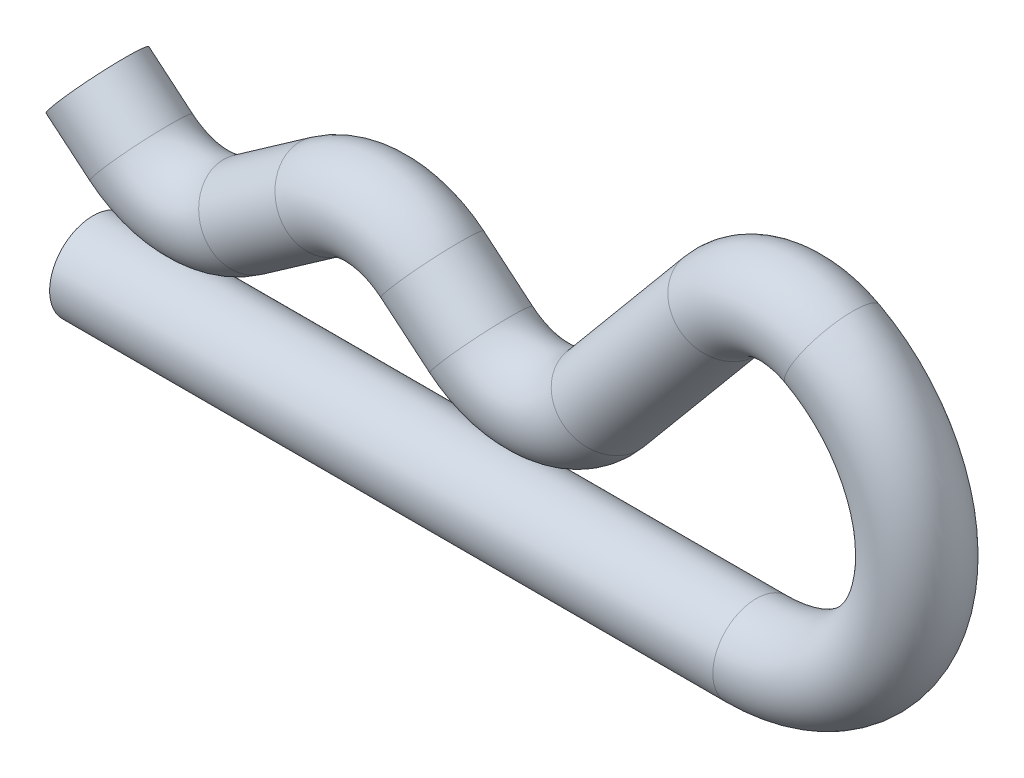
ISO-10303-21;
HEADER;
FILE_DESCRIPTION(('STEP AP214'),'2;1');
FILE_NAME('part.step','',(''),(''),'','','');
FILE_SCHEMA(('AUTOMOTIVE_DESIGN { 1 0 10303 214 1 1 1 1 }'));
ENDSEC;
DATA;
#1=APPLICATION_CONTEXT('core data for automotive mechanical design processes');
#2=APPLICATION_PROTOCOL_DEFINITION('international standard','automotive_design',2000,#1);
#3=PRODUCT_CONTEXT('',#1,'mechanical');
#4=PRODUCT('Part','Part','',(#3));
#5=PRODUCT_RELATED_PRODUCT_CATEGORY('part','',(#4));
#6=PRODUCT_DEFINITION_FORMATION('','',#4);
#7=PRODUCT_DEFINITION_CONTEXT('part definition',#1,'design');
#8=PRODUCT_DEFINITION('design','',#6,#7);
#9=PRODUCT_DEFINITION_SHAPE('','',#8);
#10=(LENGTH_UNIT() NAMED_UNIT(*) SI_UNIT(.MILLI.,.METRE.));
#11=(NAMED_UNIT(*) PLANE_ANGLE_UNIT() SI_UNIT($,.RADIAN.));
#12=(NAMED_UNIT(*) SI_UNIT($,.STERADIAN.) SOLID_ANGLE_UNIT());
#13=UNCERTAINTY_MEASURE_WITH_UNIT(LENGTH_MEASURE(1.E-05),#10,'distance_accuracy_value','');
#14=(GEOMETRIC_REPRESENTATION_CONTEXT(3) GLOBAL_UNCERTAINTY_ASSIGNED_CONTEXT((#13)) GLOBAL_UNIT_ASSIGNED_CONTEXT((#10,
#11,#12)) REPRESENTATION_CONTEXT('',''));
#15=CARTESIAN_POINT('',(0.,0.,0.));
#16=DIRECTION('',(0.,0.,1.));
#17=DIRECTION('',(1.,0.,0.));
#18=AXIS2_PLACEMENT_3D('',#15,#16,#17);
#19=CARTESIAN_POINT('',(0.,0.,0.));
#20=DIRECTION('',(1.,0.,0.));
#21=DIRECTION('',(0.,0.,-1.));
#22=AXIS2_PLACEMENT_3D('',#19,#20,#21);
#23=PLANE('',#22);
#24=CARTESIAN_POINT('',(0.,0.,0.));
#25=DIRECTION('',(1.,0.,0.));
#26=DIRECTION('',(0.,0.,-1.));
#27=AXIS2_PLACEMENT_3D('',#24,#25,#26);
#28=CIRCLE('',#27,4.9);
#29=CARTESIAN_POINT('',(0.,0.,-4.9));
#30=VERTEX_POINT('',#29);
#31=EDGE_CURVE('E71',#30,#30,#28,.T.);
#32=ORIENTED_EDGE('',*,*,#31,.F.);
#33=EDGE_LOOP('',(#32));
#34=FACE_BOUND('',#33,.T.);
#35=ADVANCED_FACE('F34',(#34),#23,.F.);
#36=CARTESIAN_POINT('',(0.509042860784836,18.4559519454546,0.));
#37=DIRECTION('',(-0.767673833045799,0.640840764977362,0.));
#38=DIRECTION('',(0.,0.,-1.));
#39=AXIS2_PLACEMENT_3D('',#36,#37,#38);
#40=PLANE('',#39);
#41=CARTESIAN_POINT('',(0.509042860784836,18.4559519454546,0.));
#42=DIRECTION('',(-0.767673833045799,0.640840764977362,0.));
#43=DIRECTION('',(0.,0.,-1.));
#44=AXIS2_PLACEMENT_3D('',#41,#42,#43);
#45=CIRCLE('',#44,4.9);
#46=CARTESIAN_POINT('',(0.509042860784836,18.4559519454546,-4.9));
#47=VERTEX_POINT('',#46);
#48=EDGE_CURVE('E10',#47,#47,#45,.T.);
#49=ORIENTED_EDGE('',*,*,#48,.T.);
#50=EDGE_LOOP('',(#49));
#51=FACE_BOUND('',#50,.T.);
#52=ADVANCED_FACE('F78',(#51),#40,.T.);
#53=CARTESIAN_POINT('',(0.,0.,0.));
#54=DIRECTION('',(1.,0.,0.));
#55=DIRECTION('',(0.,0.,-1.));
#56=AXIS2_PLACEMENT_3D('',#53,#54,#55);
#57=CYLINDRICAL_SURFACE('',#56,4.9);
#58=CARTESIAN_POINT('',(75.,0.,0.));
#59=DIRECTION('',(1.,0.,0.));
#60=DIRECTION('',(0.,0.,-1.));
#61=AXIS2_PLACEMENT_3D('',#58,#59,#60);
#62=CIRCLE('',#61,4.9);
#63=CARTESIAN_POINT('',(75.,-4.90000000000001,0.));
#64=VERTEX_POINT('',#63);
#65=EDGE_CURVE('E68',#64,#64,#62,.T.);
#66=ORIENTED_EDGE('',*,*,#65,.F.);
#67=EDGE_LOOP('',(#66));
#68=FACE_BOUND('',#67,.T.);
#69=ORIENTED_EDGE('',*,*,#31,.T.);
#70=EDGE_LOOP('',(#69));
#71=FACE_BOUND('',#70,.T.);
#72=ADVANCED_FACE('F75',(#68,#71),#57,.T.);
#73=CARTESIAN_POINT('',(75.,18.1716694751373,0.));
#74=DIRECTION('',(0.,0.,1.));
#75=DIRECTION('',(1.,0.,0.));
#76=AXIS2_PLACEMENT_3D('',#73,#74,#75);
#77=TOROIDAL_SURFACE('',#76,18.1716694751373,4.9);
#78=CARTESIAN_POINT('',(83.5982692687135,34.1803963794333,0.));
#79=DIRECTION('',(-0.880971719532947,0.473168922672614,0.));
#80=DIRECTION('',(0.,0.,-1.));
#81=AXIS2_PLACEMENT_3D('',#78,#79,#80);
#82=CIRCLE('',#81,4.9);
#83=CARTESIAN_POINT('',(85.9167969898093,38.4971578051448,0.));
#84=VERTEX_POINT('',#83);
#85=EDGE_CURVE('E65',#84,#84,#82,.T.);
#86=CARTESIAN_POINT('',(75.,18.1716694751373,0.));
#87=DIRECTION('',(0.,0.,1.));
#88=DIRECTION('',(1.,0.,0.));
#89=AXIS2_PLACEMENT_3D('',#86,#87,#88);
#90=CIRCLE('',#89,23.0716694751373);
#91=EDGE_CURVE('',#64,#84,#90,.T.);
#92=ORIENTED_EDGE('',*,*,#65,.T.);
#93=ORIENTED_EDGE('',*,*,#85,.F.);
#94=ORIENTED_EDGE('',*,*,#91,.T.);
#95=ORIENTED_EDGE('',*,*,#91,.F.);
#96=EDGE_LOOP('',(#92,#94,#93,#95));
#97=FACE_BOUND('',#96,.T.);
#98=ADVANCED_FACE('F116',(#97),#77,.T.);
#99=CARTESIAN_POINT('',(78.8665800419874,25.3706791841038,0.));
#100=DIRECTION('',(0.,0.,1.));
#101=DIRECTION('',(1.,0.,0.));
#102=AXIS2_PLACEMENT_3D('',#99,#100,#101);
#103=TOROIDAL_SURFACE('',#102,10.,4.9);
#104=CARTESIAN_POINT('',(71.1898417115294,31.7790868338775,0.));
#105=DIRECTION('',(-0.640840764977362,-0.767673833045799,0.));
#106=DIRECTION('',(0.,0.,-1.));
#107=AXIS2_PLACEMENT_3D('',#104,#105,#106);
#108=CIRCLE('',#107,4.9);
#109=CARTESIAN_POINT('',(67.428239929605,34.9192065822665,0.));
#110=VERTEX_POINT('',#109);
#111=EDGE_CURVE('E62',#110,#110,#108,.T.);
#112=CARTESIAN_POINT('',(78.8665800419874,25.3706791841038,0.));
#113=DIRECTION('',(0.,0.,1.));
#114=DIRECTION('',(1.,0.,0.));
#115=AXIS2_PLACEMENT_3D('',#112,#113,#114);
#116=CIRCLE('',#115,14.9);
#117=EDGE_CURVE('',#84,#110,#116,.T.);
#118=ORIENTED_EDGE('',*,*,#85,.T.);
#119=ORIENTED_EDGE('',*,*,#111,.F.);
#120=ORIENTED_EDGE('',*,*,#117,.T.);
#121=ORIENTED_EDGE('',*,*,#117,.F.);
#122=EDGE_LOOP('',(#118,#120,#119,#121));
#123=FACE_BOUND('',#122,.T.);
#124=ADVANCED_FACE('F112',(#123),#103,.T.);
#125=CARTESIAN_POINT('',(71.1898417115294,31.7790868338775,0.));
#126=DIRECTION('',(-0.640840764977364,-0.767673833045798,0.));
#127=DIRECTION('',(0.767673833045798,-0.640840764977364,0.));
#128=AXIS2_PLACEMENT_3D('',#125,#126,#127);
#129=CYLINDRICAL_SURFACE('',#128,4.9);
#130=CARTESIAN_POINT('',(58.0007797894035,15.9796897396642,0.));
#131=DIRECTION('',(-0.640840764977363,-0.767673833045798,0.));
#132=DIRECTION('',(0.,0.,-1.));
#133=AXIS2_PLACEMENT_3D('',#130,#131,#132);
#134=CIRCLE('',#133,4.9);
#135=CARTESIAN_POINT('',(61.7623815713279,12.8395699912751,0.));
#136=VERTEX_POINT('',#135);
#137=EDGE_CURVE('E59',#136,#136,#134,.T.);
#138=ORIENTED_EDGE('',*,*,#137,.F.);
#139=EDGE_LOOP('',(#138));
#140=FACE_BOUND('',#139,.T.);
#141=ORIENTED_EDGE('',*,*,#111,.T.);
#142=EDGE_LOOP('',(#141));
#143=FACE_BOUND('',#142,.T.);
#144=ADVANCED_FACE('F108',(#140,#143),#129,.T.);
#145=CARTESIAN_POINT('',(50.3240414589455,22.3880973894378,0.));
#146=DIRECTION('',(0.,0.,-1.));
#147=DIRECTION('',(-1.,0.,0.));
#148=AXIS2_PLACEMENT_3D('',#145,#146,#147);
#149=TOROIDAL_SURFACE('',#148,10.,4.9);
#150=CARTESIAN_POINT('',(43.9156338091719,14.7113590589799,0.));
#151=DIRECTION('',(-0.767673833045798,0.640840764977363,0.));
#152=DIRECTION('',(0.,0.,-1.));
#153=AXIS2_PLACEMENT_3D('',#150,#151,#152);
#154=CIRCLE('',#153,4.9);
#155=CARTESIAN_POINT('',(40.7755140607828,10.9497572770554,0.));
#156=VERTEX_POINT('',#155);
#157=EDGE_CURVE('E56',#156,#156,#154,.T.);
#158=CARTESIAN_POINT('',(50.3240414589455,22.3880973894378,0.));
#159=DIRECTION('',(0.,0.,-1.));
#160=DIRECTION('',(-1.,0.,0.));
#161=AXIS2_PLACEMENT_3D('',#158,#159,#160);
#162=CIRCLE('',#161,14.9);
#163=EDGE_CURVE('',#136,#156,#162,.T.);
#164=ORIENTED_EDGE('',*,*,#137,.T.);
#165=ORIENTED_EDGE('',*,*,#157,.F.);
#166=ORIENTED_EDGE('',*,*,#163,.T.);
#167=ORIENTED_EDGE('',*,*,#163,.F.);
#168=EDGE_LOOP('',(#164,#166,#165,#167));
#169=FACE_BOUND('',#168,.T.);
#170=ADVANCED_FACE('F104',(#169),#149,.T.);
#171=CARTESIAN_POINT('',(43.9156338091719,14.7113590589798,0.));
#172=DIRECTION('',(-0.767673833045799,0.640840764977362,0.));
#173=DIRECTION('',(-0.640840764977362,-0.767673833045799,0.));
#174=AXIS2_PLACEMENT_3D('',#171,#172,#173);
#175=CYLINDRICAL_SURFACE('',#174,4.9);
#176=CARTESIAN_POINT('',(38.3764944776274,19.3353362400953,0.));
#177=DIRECTION('',(-0.767673833045799,0.640840764977362,0.));
#178=DIRECTION('',(0.,0.,-1.));
#179=AXIS2_PLACEMENT_3D('',#176,#177,#178);
#180=CIRCLE('',#179,4.9);
#181=CARTESIAN_POINT('',(41.5166142260165,23.0969380220197,0.));
#182=VERTEX_POINT('',#181);
#183=EDGE_CURVE('E53',#182,#182,#180,.T.);
#184=ORIENTED_EDGE('',*,*,#183,.F.);
#185=EDGE_LOOP('',(#184));
#186=FACE_BOUND('',#185,.T.);
#187=ORIENTED_EDGE('',*,*,#157,.T.);
#188=EDGE_LOOP('',(#187));
#189=FACE_BOUND('',#188,.T.);
#190=ADVANCED_FACE('F100',(#186,#189),#175,.T.);
#191=CARTESIAN_POINT('',(31.9680868278537,11.6585979096373,0.));
#192=DIRECTION('',(0.,0.,1.));
#193=DIRECTION('',(1.,0.,0.));
#194=AXIS2_PLACEMENT_3D('',#191,#192,#193);
#195=TOROIDAL_SURFACE('',#194,10.,4.9);
#196=CARTESIAN_POINT('',(26.2323825152476,19.850160400295,0.));
#197=DIRECTION('',(-0.819156249065774,-0.573570431260617,0.));
#198=DIRECTION('',(0.,0.,-1.));
#199=AXIS2_PLACEMENT_3D('',#196,#197,#198);
#200=CIRCLE('',#199,4.9);
#201=CARTESIAN_POINT('',(23.4218874020706,23.8640260207173,0.));
#202=VERTEX_POINT('',#201);
#203=EDGE_CURVE('E48',#202,#202,#200,.T.);
#204=CARTESIAN_POINT('',(31.9680868278537,11.6585979096373,0.));
#205=DIRECTION('',(0.,0.,1.));
#206=DIRECTION('',(1.,0.,0.));
#207=AXIS2_PLACEMENT_3D('',#204,#205,#206);
#208=CIRCLE('',#207,14.9);
#209=EDGE_CURVE('',#182,#202,#208,.T.);
#210=ORIENTED_EDGE('',*,*,#183,.T.);
#211=ORIENTED_EDGE('',*,*,#203,.F.);
#212=ORIENTED_EDGE('',*,*,#209,.T.);
#213=ORIENTED_EDGE('',*,*,#209,.F.);
#214=EDGE_LOOP('',(#210,#212,#211,#213));
#215=FACE_BOUND('',#214,.T.);
#216=ADVANCED_FACE('F96',(#215),#195,.T.);
#217=CARTESIAN_POINT('',(26.2323825152476,19.850160400295,0.));
#218=DIRECTION('',(-0.819156249065775,-0.573570431260617,0.));
#219=DIRECTION('',(0.573570431260617,-0.819156249065775,0.));
#220=AXIS2_PLACEMENT_3D('',#217,#218,#219);
#221=CYLINDRICAL_SURFACE('',#220,4.9);
#222=CARTESIAN_POINT('',(17.6037733828515,13.8084375093423,0.));
#223=DIRECTION('',(-0.819156249065775,-0.573570431260618,0.));
#224=DIRECTION('',(0.,0.,-1.));
#225=AXIS2_PLACEMENT_3D('',#222,#223,#224);
#226=CIRCLE('',#225,4.9);
#227=CARTESIAN_POINT('',(20.4142684960286,9.79457188891996,0.));
#228=VERTEX_POINT('',#227);
#229=EDGE_CURVE('E44',#228,#228,#226,.T.);
#230=ORIENTED_EDGE('',*,*,#229,.F.);
#231=EDGE_LOOP('',(#230));
#232=FACE_BOUND('',#231,.T.);
#233=ORIENTED_EDGE('',*,*,#203,.T.);
#234=EDGE_LOOP('',(#233));
#235=FACE_BOUND('',#234,.T.);
#236=ADVANCED_FACE('F90',(#232,#235),#221,.T.);
#237=CARTESIAN_POINT('',(11.8680690702454,22.,0.));
#238=DIRECTION('',(0.,0.,-1.));
#239=DIRECTION('',(-1.,0.,0.));
#240=AXIS2_PLACEMENT_3D('',#237,#238,#239);
#241=TOROIDAL_SURFACE('',#240,10.,4.9);
#242=CARTESIAN_POINT('',(5.45966142047172,14.323261669542,0.));
#243=DIRECTION('',(-0.767673833045798,0.640840764977363,0.));
#244=DIRECTION('',(0.,0.,-1.));
#245=AXIS2_PLACEMENT_3D('',#242,#243,#244);
#246=CIRCLE('',#245,4.9);
#247=CARTESIAN_POINT('',(2.31954167208264,10.5616598876176,0.));
#248=VERTEX_POINT('',#247);
#249=EDGE_CURVE('E40',#248,#248,#246,.T.);
#250=CARTESIAN_POINT('',(11.8680690702454,22.,0.));
#251=DIRECTION('',(0.,0.,-1.));
#252=DIRECTION('',(-1.,0.,0.));
#253=AXIS2_PLACEMENT_3D('',#250,#251,#252);
#254=CIRCLE('',#253,14.9);
#255=EDGE_CURVE('',#228,#248,#254,.T.);
#256=ORIENTED_EDGE('',*,*,#229,.T.);
#257=ORIENTED_EDGE('',*,*,#249,.F.);
#258=ORIENTED_EDGE('',*,*,#255,.T.);
#259=ORIENTED_EDGE('',*,*,#255,.F.);
#260=EDGE_LOOP('',(#256,#258,#257,#259));
#261=FACE_BOUND('',#260,.T.);
#262=ADVANCED_FACE('F84',(#261),#241,.T.);
#263=CARTESIAN_POINT('',(5.45966142047172,14.323261669542,0.));
#264=DIRECTION('',(-0.767673833045799,0.640840764977362,0.));
#265=DIRECTION('',(-0.640840764977362,-0.767673833045799,0.));
#266=AXIS2_PLACEMENT_3D('',#263,#264,#265);
#267=CYLINDRICAL_SURFACE('',#266,4.9);
#268=ORIENTED_EDGE('',*,*,#48,.F.);
#269=EDGE_LOOP('',(#268));
#270=FACE_BOUND('',#269,.T.);
#271=ORIENTED_EDGE('',*,*,#249,.T.);
#272=EDGE_LOOP('',(#271));
#273=FACE_BOUND('',#272,.T.);
#274=ADVANCED_FACE('F82',(#270,#273),#267,.T.);
#275=CLOSED_SHELL('',(#35,#52,#72,#98,#124,#144,#170,#190,#216,#236,#262,#274));
#276=MANIFOLD_SOLID_BREP('B2',#275);
#277=ADVANCED_BREP_SHAPE_REPRESENTATION('',(#18,#276),#14);
#278=SHAPE_DEFINITION_REPRESENTATION(#9,#277);
ENDSEC;
END-ISO-10303-21;
